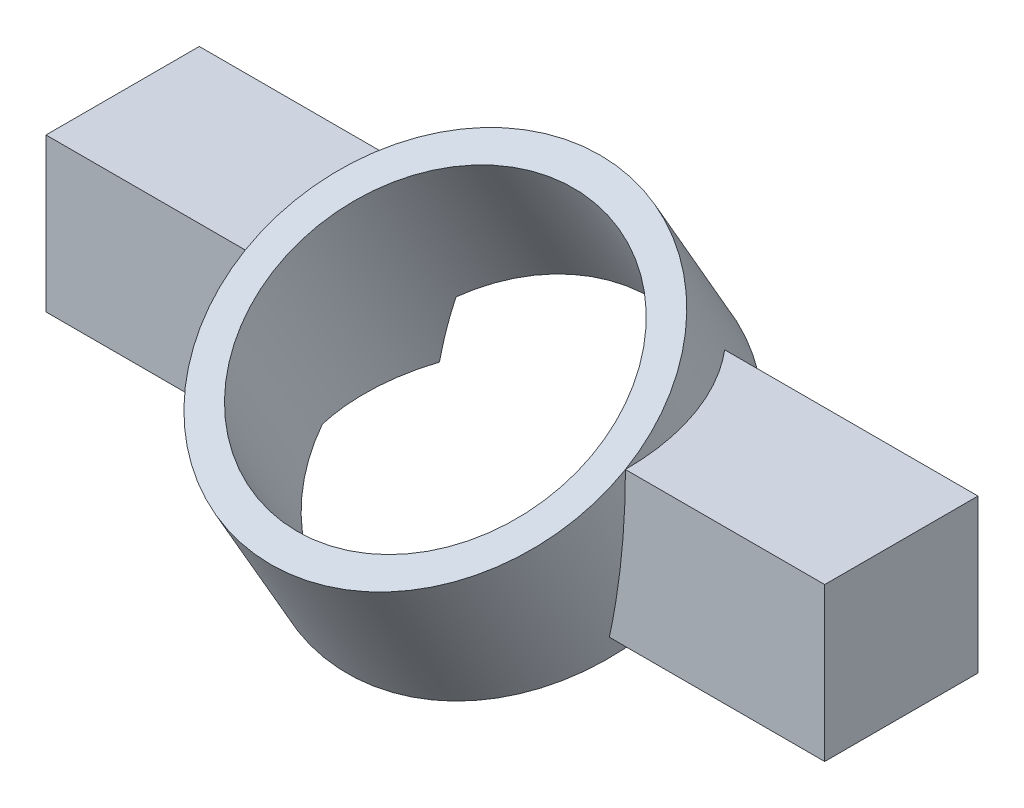
ISO-10303-21;
HEADER;
FILE_DESCRIPTION(('STEP AP214'),'2;1');
FILE_NAME('part.step','',(''),(''),'','','');
FILE_SCHEMA(('AUTOMOTIVE_DESIGN { 1 0 10303 214 1 1 1 1 }'));
ENDSEC;
DATA;
#1=APPLICATION_CONTEXT('core data for automotive mechanical design processes');
#2=APPLICATION_PROTOCOL_DEFINITION('international standard','automotive_design',2000,#1);
#3=PRODUCT_CONTEXT('',#1,'mechanical');
#4=PRODUCT('Part','Part','',(#3));
#5=PRODUCT_RELATED_PRODUCT_CATEGORY('part','',(#4));
#6=PRODUCT_DEFINITION_FORMATION('','',#4);
#7=PRODUCT_DEFINITION_CONTEXT('part definition',#1,'design');
#8=PRODUCT_DEFINITION('design','',#6,#7);
#9=PRODUCT_DEFINITION_SHAPE('','',#8);
#10=(LENGTH_UNIT() NAMED_UNIT(*) SI_UNIT(.MILLI.,.METRE.));
#11=(NAMED_UNIT(*) PLANE_ANGLE_UNIT() SI_UNIT($,.RADIAN.));
#12=(NAMED_UNIT(*) SI_UNIT($,.STERADIAN.) SOLID_ANGLE_UNIT());
#13=UNCERTAINTY_MEASURE_WITH_UNIT(LENGTH_MEASURE(1.E-05),#10,'distance_accuracy_value','');
#14=(GEOMETRIC_REPRESENTATION_CONTEXT(3) GLOBAL_UNCERTAINTY_ASSIGNED_CONTEXT((#13)) GLOBAL_UNIT_ASSIGNED_CONTEXT((#10,
#11,#12)) REPRESENTATION_CONTEXT('',''));
#15=CARTESIAN_POINT('',(0.,0.,0.));
#16=DIRECTION('',(0.,0.,1.));
#17=DIRECTION('',(1.,0.,0.));
#18=AXIS2_PLACEMENT_3D('',#15,#16,#17);
#19=CARTESIAN_POINT('',(-23.7510638297872,5.,-5.));
#20=DIRECTION('',(0.,0.,1.));
#21=DIRECTION('',(1.,0.,0.));
#22=AXIS2_PLACEMENT_3D('',#19,#20,#21);
#23=PLANE('',#22);
#24=DIRECTION('',(-1.,0.,0.));
#25=VECTOR('',#24,1.);
#26=CARTESIAN_POINT('',(-23.7510638297872,2.11324865405187,-5.));
#27=LINE('',#26,#25);
#28=CARTESIAN_POINT('',(-15.3761842520029,2.11324865405187,-5.));
#29=VERTEX_POINT('',#28);
#30=CARTESIAN_POINT('',(-16.5380180547345,2.11324865405187,-5.));
#31=VERTEX_POINT('',#30);
#32=EDGE_CURVE('E162',#29,#31,#27,.T.);
#33=ORIENTED_EDGE('',*,*,#32,.F.);
#34=CARTESIAN_POINT('',(-11.0510638297872,-3.66025403784436,-5.));
#35=DIRECTION('',(0.,0.,1.));
#36=DIRECTION('',(0.,1.,0.));
#37=AXIS2_PLACEMENT_3D('',#34,#35,#36);
#38=ELLIPSE('',#37,10.4,5.2);
#39=CARTESIAN_POINT('',(-15.9183664806002,0.,-5.));
#40=VERTEX_POINT('',#39);
#41=EDGE_CURVE('E135',#29,#40,#38,.T.);
#42=ORIENTED_EDGE('',*,*,#41,.T.);
#43=DIRECTION('',(-1.,0.,0.));
#44=VECTOR('',#43,1.);
#45=CARTESIAN_POINT('',(-23.7510638297872,0.,-5.));
#46=LINE('',#45,#44);
#47=CARTESIAN_POINT('',(-23.7510638297872,0.,-5.));
#48=VERTEX_POINT('',#47);
#49=EDGE_CURVE('E131',#40,#48,#46,.T.);
#50=ORIENTED_EDGE('',*,*,#49,.T.);
#51=DIRECTION('',(0.,-1.,0.));
#52=VECTOR('',#51,1.);
#53=CARTESIAN_POINT('',(-23.7510638297872,5.,-5.));
#54=LINE('',#53,#52);
#55=CARTESIAN_POINT('',(-23.7510638297872,5.,-5.));
#56=VERTEX_POINT('',#55);
#57=EDGE_CURVE('E205',#56,#48,#54,.T.);
#58=ORIENTED_EDGE('',*,*,#57,.F.);
#59=DIRECTION('',(-1.,0.,0.));
#60=VECTOR('',#59,1.);
#61=CARTESIAN_POINT('',(-23.7510638297872,5.,-5.));
#62=LINE('',#61,#60);
#63=CARTESIAN_POINT('',(-15.488405376254,5.,-5.));
#64=VERTEX_POINT('',#63);
#65=EDGE_CURVE('E177',#64,#56,#62,.T.);
#66=ORIENTED_EDGE('',*,*,#65,.F.);
#67=CARTESIAN_POINT('',(-11.0510638297872,-3.66025403784436,-5.));
#68=DIRECTION('',(0.,0.,1.));
#69=DIRECTION('',(0.,1.,0.));
#70=AXIS2_PLACEMENT_3D('',#67,#68,#69);
#71=ELLIPSE('',#70,12.4,6.2);
#72=EDGE_CURVE('E59',#64,#31,#71,.T.);
#73=ORIENTED_EDGE('',*,*,#72,.T.);
#74=EDGE_LOOP('',(#33,#42,#50,#58,#66,#73));
#75=FACE_BOUND('',#74,.T.);
#76=ADVANCED_FACE('F35',(#75),#23,.F.);
#77=CARTESIAN_POINT('',(0.,0.,0.));
#78=DIRECTION('',(0.,1.,0.));
#79=DIRECTION('',(0.,0.,1.));
#80=AXIS2_PLACEMENT_3D('',#77,#78,#79);
#81=PLANE('',#80);
#82=DIRECTION('',(1.,0.,0.));
#83=VECTOR('',#82,1.);
#84=CARTESIAN_POINT('',(0.,0.,-1.33974596215562));
#85=LINE('',#84,#83);
#86=CARTESIAN_POINT('',(-6.02661552605401,0.,-1.33974596215562));
#87=VERTEX_POINT('',#86);
#88=CARTESIAN_POINT('',(-4.99754578183465,0.,-1.33974596215562));
#89=VERTEX_POINT('',#88);
#90=EDGE_CURVE('E44',#87,#89,#85,.T.);
#91=ORIENTED_EDGE('',*,*,#90,.F.);
#92=CARTESIAN_POINT('',(-11.0510638297872,0.,-2.88675134594814));
#93=DIRECTION('',(0.,1.,0.));
#94=DIRECTION('',(0.,0.,1.));
#95=AXIS2_PLACEMENT_3D('',#92,#93,#94);
#96=ELLIPSE('',#95,6.00444279957211,5.2);
#97=CARTESIAN_POINT('',(-6.18376117897426,0.,-5.));
#98=VERTEX_POINT('',#97);
#99=EDGE_CURVE('E137',#87,#98,#96,.T.);
#100=ORIENTED_EDGE('',*,*,#99,.T.);
#101=CARTESIAN_POINT('',(1.64893617021276,0.,-5.));
#102=VERTEX_POINT('',#101);
#103=EDGE_CURVE('E192',#102,#98,#46,.T.);
#104=ORIENTED_EDGE('',*,*,#103,.F.);
#105=DIRECTION('',(0.,0.,-1.));
#106=VECTOR('',#105,1.);
#107=CARTESIAN_POINT('',(1.64893617021276,0.,-5.));
#108=LINE('',#107,#106);
#109=CARTESIAN_POINT('',(1.64893617021276,0.,0.));
#110=VERTEX_POINT('',#109);
#111=EDGE_CURVE('E189',#110,#102,#108,.T.);
#112=ORIENTED_EDGE('',*,*,#111,.F.);
#113=DIRECTION('',(1.,0.,0.));
#114=VECTOR('',#113,1.);
#115=CARTESIAN_POINT('',(-23.7510638297872,0.,0.));
#116=LINE('',#115,#114);
#117=CARTESIAN_POINT('',(-5.37744064878552,0.,0.));
#118=VERTEX_POINT('',#117);
#119=EDGE_CURVE('E197',#118,#110,#116,.T.);
#120=ORIENTED_EDGE('',*,*,#119,.F.);
#121=CARTESIAN_POINT('',(-11.0510638297872,0.,-2.88675134594814));
#122=DIRECTION('',(0.,1.,0.));
#123=DIRECTION('',(0.,0.,1.));
#124=AXIS2_PLACEMENT_3D('',#121,#122,#123);
#125=ELLIPSE('',#124,7.15914333795136,6.2);
#126=EDGE_CURVE('E11',#118,#89,#125,.T.);
#127=ORIENTED_EDGE('',*,*,#126,.T.);
#128=EDGE_LOOP('',(#91,#100,#104,#112,#120,#127));
#129=FACE_BOUND('',#128,.T.);
#130=ADVANCED_FACE('F218',(#129),#81,.F.);
#131=CARTESIAN_POINT('',(-23.7510638297872,5.,0.));
#132=DIRECTION('',(0.,0.,-1.));
#133=DIRECTION('',(-1.,0.,0.));
#134=AXIS2_PLACEMENT_3D('',#131,#132,#133);
#135=PLANE('',#134);
#136=DIRECTION('',(1.,0.,0.));
#137=VECTOR('',#136,1.);
#138=CARTESIAN_POINT('',(-23.7510638297872,5.,0.));
#139=LINE('',#138,#137);
#140=CARTESIAN_POINT('',(-4.85106382978723,5.,0.));
#141=VERTEX_POINT('',#140);
#142=CARTESIAN_POINT('',(1.64893617021276,5.,0.));
#143=VERTEX_POINT('',#142);
#144=EDGE_CURVE('E184',#141,#143,#139,.T.);
#145=ORIENTED_EDGE('',*,*,#144,.F.);
#146=CARTESIAN_POINT('',(-11.0510638297872,5.,0.));
#147=DIRECTION('',(0.,0.,-1.));
#148=DIRECTION('',(0.,1.,0.));
#149=AXIS2_PLACEMENT_3D('',#146,#147,#148);
#150=ELLIPSE('',#149,12.4,6.2);
#151=EDGE_CURVE('E168',#141,#118,#150,.T.);
#152=ORIENTED_EDGE('',*,*,#151,.T.);
#153=ORIENTED_EDGE('',*,*,#119,.T.);
#154=DIRECTION('',(0.,-1.,0.));
#155=VECTOR('',#154,1.);
#156=CARTESIAN_POINT('',(1.64893617021276,5.,0.));
#157=LINE('',#156,#155);
#158=EDGE_CURVE('E188',#143,#110,#157,.T.);
#159=ORIENTED_EDGE('',*,*,#158,.F.);
#160=EDGE_LOOP('',(#145,#152,#153,#159));
#161=FACE_BOUND('',#160,.T.);
#162=ADVANCED_FACE('F234',(#161),#135,.F.);
#163=CARTESIAN_POINT('',(0.,5.,0.));
#164=DIRECTION('',(0.,1.,0.));
#165=DIRECTION('',(0.,0.,1.));
#166=AXIS2_PLACEMENT_3D('',#163,#164,#165);
#167=PLANE('',#166);
#168=CARTESIAN_POINT('',(-11.0510638297872,5.,0.));
#169=DIRECTION('',(0.,1.,0.));
#170=DIRECTION('',(0.,0.,1.));
#171=AXIS2_PLACEMENT_3D('',#168,#169,#170);
#172=ELLIPSE('',#171,7.15914333795136,6.2);
#173=CARTESIAN_POINT('',(-6.61372228332047,5.,-5.));
#174=VERTEX_POINT('',#173);
#175=EDGE_CURVE('E171',#141,#174,#172,.T.);
#176=ORIENTED_EDGE('',*,*,#175,.F.);
#177=ORIENTED_EDGE('',*,*,#144,.T.);
#178=DIRECTION('',(0.,0.,-1.));
#179=VECTOR('',#178,1.);
#180=CARTESIAN_POINT('',(1.64893617021276,5.,-5.));
#181=LINE('',#180,#179);
#182=CARTESIAN_POINT('',(1.64893617021276,5.,-5.));
#183=VERTEX_POINT('',#182);
#184=EDGE_CURVE('E174',#143,#183,#181,.T.);
#185=ORIENTED_EDGE('',*,*,#184,.T.);
#186=EDGE_CURVE('E179',#183,#174,#62,.T.);
#187=ORIENTED_EDGE('',*,*,#186,.T.);
#188=EDGE_LOOP('',(#176,#177,#185,#187));
#189=FACE_BOUND('',#188,.T.);
#190=ADVANCED_FACE('F259',(#189),#167,.T.);
#191=CARTESIAN_POINT('',(1.64893617021276,5.,-5.));
#192=DIRECTION('',(-1.,0.,0.));
#193=DIRECTION('',(0.,0.,1.));
#194=AXIS2_PLACEMENT_3D('',#191,#192,#193);
#195=PLANE('',#194);
#196=ORIENTED_EDGE('',*,*,#111,.T.);
#197=DIRECTION('',(0.,-1.,0.));
#198=VECTOR('',#197,1.);
#199=CARTESIAN_POINT('',(1.64893617021276,5.,-5.));
#200=LINE('',#199,#198);
#201=EDGE_CURVE('E146',#183,#102,#200,.T.);
#202=ORIENTED_EDGE('',*,*,#201,.F.);
#203=ORIENTED_EDGE('',*,*,#184,.F.);
#204=ORIENTED_EDGE('',*,*,#158,.T.);
#205=EDGE_LOOP('',(#196,#202,#203,#204));
#206=FACE_BOUND('',#205,.T.);
#207=ADVANCED_FACE('F37',(#206),#195,.F.);
#208=ORIENTED_EDGE('',*,*,#103,.T.);
#209=CARTESIAN_POINT('',(-6.72594340757161,2.11324865405187,-5.));
#210=VERTEX_POINT('',#209);
#211=EDGE_CURVE('E51',#98,#210,#38,.T.);
#212=ORIENTED_EDGE('',*,*,#211,.T.);
#213=CARTESIAN_POINT('',(-5.56410960483997,2.11324865405187,-5.));
#214=VERTEX_POINT('',#213);
#215=EDGE_CURVE('E164',#214,#210,#27,.T.);
#216=ORIENTED_EDGE('',*,*,#215,.F.);
#217=EDGE_CURVE('E173',#214,#174,#71,.T.);
#218=ORIENTED_EDGE('',*,*,#217,.T.);
#219=ORIENTED_EDGE('',*,*,#186,.F.);
#220=ORIENTED_EDGE('',*,*,#201,.T.);
#221=EDGE_LOOP('',(#208,#212,#216,#218,#219,#220));
#222=FACE_BOUND('',#221,.T.);
#223=ADVANCED_FACE('F211',(#222),#23,.F.);
#224=CARTESIAN_POINT('',(-23.7510638297872,5.,-5.));
#225=DIRECTION('',(1.,0.,0.));
#226=DIRECTION('',(0.,0.,-1.));
#227=AXIS2_PLACEMENT_3D('',#224,#225,#226);
#228=PLANE('',#227);
#229=DIRECTION('',(0.,0.,1.));
#230=VECTOR('',#229,1.);
#231=CARTESIAN_POINT('',(-23.7510638297872,0.,-5.));
#232=LINE('',#231,#230);
#233=CARTESIAN_POINT('',(-23.7510638297872,0.,0.));
#234=VERTEX_POINT('',#233);
#235=EDGE_CURVE('E195',#48,#234,#232,.T.);
#236=ORIENTED_EDGE('',*,*,#235,.T.);
#237=DIRECTION('',(0.,-1.,0.));
#238=VECTOR('',#237,1.);
#239=CARTESIAN_POINT('',(-23.7510638297872,5.,0.));
#240=LINE('',#239,#238);
#241=CARTESIAN_POINT('',(-23.7510638297872,5.,0.));
#242=VERTEX_POINT('',#241);
#243=EDGE_CURVE('E202',#242,#234,#240,.T.);
#244=ORIENTED_EDGE('',*,*,#243,.F.);
#245=DIRECTION('',(0.,0.,1.));
#246=VECTOR('',#245,1.);
#247=CARTESIAN_POINT('',(-23.7510638297872,5.,-5.));
#248=LINE('',#247,#246);
#249=EDGE_CURVE('E182',#56,#242,#248,.T.);
#250=ORIENTED_EDGE('',*,*,#249,.F.);
#251=ORIENTED_EDGE('',*,*,#57,.T.);
#252=EDGE_LOOP('',(#236,#244,#250,#251));
#253=FACE_BOUND('',#252,.T.);
#254=ADVANCED_FACE('F248',(#253),#228,.F.);
#255=CARTESIAN_POINT('',(-16.7246870107889,0.,0.));
#256=VERTEX_POINT('',#255);
#257=EDGE_CURVE('E178',#234,#256,#116,.T.);
#258=ORIENTED_EDGE('',*,*,#257,.T.);
#259=CARTESIAN_POINT('',(-17.2510638297872,5.,0.));
#260=VERTEX_POINT('',#259);
#261=EDGE_CURVE('E165',#256,#260,#150,.T.);
#262=ORIENTED_EDGE('',*,*,#261,.T.);
#263=EDGE_CURVE('E185',#242,#260,#139,.T.);
#264=ORIENTED_EDGE('',*,*,#263,.F.);
#265=ORIENTED_EDGE('',*,*,#243,.T.);
#266=EDGE_LOOP('',(#258,#262,#264,#265));
#267=FACE_BOUND('',#266,.T.);
#268=ADVANCED_FACE('F251',(#267),#135,.F.);
#269=EDGE_CURVE('E167',#64,#260,#172,.T.);
#270=ORIENTED_EDGE('',*,*,#269,.F.);
#271=ORIENTED_EDGE('',*,*,#65,.T.);
#272=ORIENTED_EDGE('',*,*,#249,.T.);
#273=ORIENTED_EDGE('',*,*,#263,.T.);
#274=EDGE_LOOP('',(#270,#271,#272,#273));
#275=FACE_BOUND('',#274,.T.);
#276=ADVANCED_FACE('F243',(#275),#167,.T.);
#277=ORIENTED_EDGE('',*,*,#49,.F.);
#278=CARTESIAN_POINT('',(-16.0755121335205,0.,-1.33974596215562));
#279=VERTEX_POINT('',#278);
#280=EDGE_CURVE('E125',#40,#279,#96,.T.);
#281=ORIENTED_EDGE('',*,*,#280,.T.);
#282=CARTESIAN_POINT('',(-17.1045818777398,0.,-1.33974596215562));
#283=VERTEX_POINT('',#282);
#284=EDGE_CURVE('E128',#283,#279,#85,.T.);
#285=ORIENTED_EDGE('',*,*,#284,.F.);
#286=EDGE_CURVE('E39',#283,#256,#125,.T.);
#287=ORIENTED_EDGE('',*,*,#286,.T.);
#288=ORIENTED_EDGE('',*,*,#257,.F.);
#289=ORIENTED_EDGE('',*,*,#235,.F.);
#290=EDGE_LOOP('',(#277,#281,#285,#287,#288,#289));
#291=FACE_BOUND('',#290,.T.);
#292=ADVANCED_FACE('F127',(#291),#81,.F.);
#293=CARTESIAN_POINT('',(-11.0510638297872,5.,0.));
#294=DIRECTION('',(0.,0.866025403784438,0.500000000000001));
#295=DIRECTION('',(0.,-0.500000000000001,0.866025403784438));
#296=AXIS2_PLACEMENT_3D('',#293,#294,#295);
#297=PLANE('',#296);
#298=CARTESIAN_POINT('',(-11.0510638297872,5.,0.));
#299=DIRECTION('',(0.,0.866025403784438,0.500000000000001));
#300=DIRECTION('',(0.,-0.500000000000001,0.866025403784438));
#301=AXIS2_PLACEMENT_3D('',#298,#299,#300);
#302=CIRCLE('',#301,5.2);
#303=CARTESIAN_POINT('',(-11.0510638297872,2.4,4.50333209967908));
#304=VERTEX_POINT('',#303);
#305=EDGE_CURVE('E134',#304,#304,#302,.T.);
#306=ORIENTED_EDGE('',*,*,#305,.F.);
#307=EDGE_LOOP('',(#306));
#308=FACE_BOUND('',#307,.T.);
#309=CARTESIAN_POINT('',(-11.0510638297872,5.,0.));
#310=DIRECTION('',(0.,0.866025403784438,0.500000000000001));
#311=DIRECTION('',(0.,-0.500000000000001,0.866025403784438));
#312=AXIS2_PLACEMENT_3D('',#309,#310,#311);
#313=CIRCLE('',#312,6.2);
#314=EDGE_CURVE('E159',#141,#260,#313,.T.);
#315=ORIENTED_EDGE('',*,*,#314,.T.);
#316=EDGE_CURVE('E152',#260,#141,#313,.T.);
#317=ORIENTED_EDGE('',*,*,#316,.T.);
#318=EDGE_LOOP('',(#315,#317));
#319=FACE_BOUND('',#318,.T.);
#320=ADVANCED_FACE('F241',(#308,#319),#297,.T.);
#321=CARTESIAN_POINT('',(-11.0510638297872,0.669872981077809,-2.50000000000001));
#322=DIRECTION('',(0.,0.866025403784438,0.500000000000001));
#323=DIRECTION('',(0.,-0.500000000000001,0.866025403784438));
#324=AXIS2_PLACEMENT_3D('',#321,#322,#323);
#325=CYLINDRICAL_SURFACE('',#324,6.2);
#326=ORIENTED_EDGE('',*,*,#217,.F.);
#327=CARTESIAN_POINT('',(-11.0510638297872,0.669872981077809,-2.50000000000001));
#328=DIRECTION('',(0.,0.866025403784438,0.500000000000001));
#329=DIRECTION('',(0.,-0.500000000000001,0.866025403784438));
#330=AXIS2_PLACEMENT_3D('',#327,#328,#329);
#331=CIRCLE('',#330,6.2);
#332=EDGE_CURVE('E158',#214,#31,#331,.T.);
#333=ORIENTED_EDGE('',*,*,#332,.T.);
#334=ORIENTED_EDGE('',*,*,#72,.F.);
#335=ORIENTED_EDGE('',*,*,#269,.T.);
#336=ORIENTED_EDGE('',*,*,#314,.F.);
#337=ORIENTED_EDGE('',*,*,#175,.T.);
#338=EDGE_LOOP('',(#326,#333,#334,#335,#336,#337));
#339=FACE_BOUND('',#338,.T.);
#340=ADVANCED_FACE('F229',(#339),#325,.T.);
#341=ORIENTED_EDGE('',*,*,#151,.F.);
#342=ORIENTED_EDGE('',*,*,#316,.F.);
#343=ORIENTED_EDGE('',*,*,#261,.F.);
#344=ORIENTED_EDGE('',*,*,#286,.F.);
#345=EDGE_CURVE('E145',#283,#89,#331,.T.);
#346=ORIENTED_EDGE('',*,*,#345,.T.);
#347=ORIENTED_EDGE('',*,*,#126,.F.);
#348=EDGE_LOOP('',(#341,#342,#343,#344,#346,#347));
#349=FACE_BOUND('',#348,.T.);
#350=ADVANCED_FACE('F238',(#349),#325,.T.);
#351=CARTESIAN_POINT('',(-11.0510638297872,0.669872981077809,-2.50000000000001));
#352=DIRECTION('',(0.,0.866025403784438,0.500000000000001));
#353=DIRECTION('',(0.,-0.500000000000001,0.866025403784438));
#354=AXIS2_PLACEMENT_3D('',#351,#352,#353);
#355=PLANE('',#354);
#356=ORIENTED_EDGE('',*,*,#332,.F.);
#357=ORIENTED_EDGE('',*,*,#215,.T.);
#358=CARTESIAN_POINT('',(-11.0510638297872,0.669872981077809,-2.50000000000001));
#359=DIRECTION('',(0.,0.866025403784438,0.500000000000001));
#360=DIRECTION('',(0.,-0.500000000000001,0.866025403784438));
#361=AXIS2_PLACEMENT_3D('',#358,#359,#360);
#362=CIRCLE('',#361,5.2);
#363=EDGE_CURVE('E149',#210,#29,#362,.T.);
#364=ORIENTED_EDGE('',*,*,#363,.T.);
#365=ORIENTED_EDGE('',*,*,#32,.T.);
#366=EDGE_LOOP('',(#356,#357,#364,#365));
#367=FACE_BOUND('',#366,.T.);
#368=ADVANCED_FACE('F224',(#367),#355,.F.);
#369=ORIENTED_EDGE('',*,*,#345,.F.);
#370=ORIENTED_EDGE('',*,*,#284,.T.);
#371=EDGE_CURVE('E143',#279,#87,#362,.T.);
#372=ORIENTED_EDGE('',*,*,#371,.T.);
#373=ORIENTED_EDGE('',*,*,#90,.T.);
#374=EDGE_LOOP('',(#369,#370,#372,#373));
#375=FACE_BOUND('',#374,.T.);
#376=ADVANCED_FACE('F141',(#375),#355,.F.);
#377=CARTESIAN_POINT('',(-11.0510638297872,0.669872981077809,-2.50000000000001));
#378=DIRECTION('',(0.,0.866025403784438,0.500000000000001));
#379=DIRECTION('',(0.,-0.500000000000001,0.866025403784438));
#380=AXIS2_PLACEMENT_3D('',#377,#378,#379);
#381=CYLINDRICAL_SURFACE('',#380,5.2);
#382=ORIENTED_EDGE('',*,*,#305,.T.);
#383=EDGE_LOOP('',(#382));
#384=FACE_BOUND('',#383,.T.);
#385=ORIENTED_EDGE('',*,*,#41,.F.);
#386=ORIENTED_EDGE('',*,*,#363,.F.);
#387=ORIENTED_EDGE('',*,*,#211,.F.);
#388=ORIENTED_EDGE('',*,*,#99,.F.);
#389=ORIENTED_EDGE('',*,*,#371,.F.);
#390=ORIENTED_EDGE('',*,*,#280,.F.);
#391=EDGE_LOOP('',(#385,#386,#387,#388,#389,#390));
#392=FACE_BOUND('',#391,.T.);
#393=ADVANCED_FACE('F147',(#384,#392),#381,.F.);
#394=CLOSED_SHELL('',(#76,#130,#162,#190,#207,#223,#254,#268,#276,#292,#320,#340,#350,#368,#376,#393));
#395=MANIFOLD_SOLID_BREP('B2',#394);
#396=ADVANCED_BREP_SHAPE_REPRESENTATION('',(#18,#395),#14);
#397=SHAPE_DEFINITION_REPRESENTATION(#9,#396);
ENDSEC;
END-ISO-10303-21;
